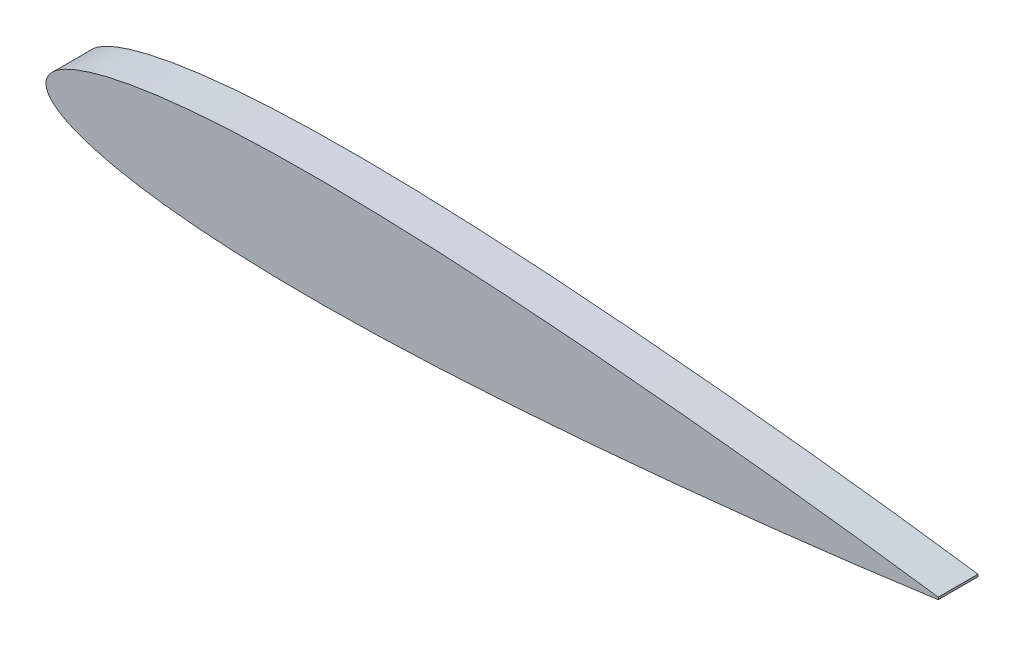
ISO-10303-21;
HEADER;
FILE_DESCRIPTION(('STEP AP214'),'2;1');
FILE_NAME('part.step','',(''),(''),'','','');
FILE_SCHEMA(('AUTOMOTIVE_DESIGN { 1 0 10303 214 1 1 1 1 }'));
ENDSEC;
DATA;
#1=APPLICATION_CONTEXT('core data for automotive mechanical design processes');
#2=APPLICATION_PROTOCOL_DEFINITION('international standard','automotive_design',2000,#1);
#3=PRODUCT_CONTEXT('',#1,'mechanical');
#4=PRODUCT('Part','Part','',(#3));
#5=PRODUCT_RELATED_PRODUCT_CATEGORY('part','',(#4));
#6=PRODUCT_DEFINITION_FORMATION('','',#4);
#7=PRODUCT_DEFINITION_CONTEXT('part definition',#1,'design');
#8=PRODUCT_DEFINITION('design','',#6,#7);
#9=PRODUCT_DEFINITION_SHAPE('','',#8);
#10=(LENGTH_UNIT() NAMED_UNIT(*) SI_UNIT(.MILLI.,.METRE.));
#11=(NAMED_UNIT(*) PLANE_ANGLE_UNIT() SI_UNIT($,.RADIAN.));
#12=(NAMED_UNIT(*) SI_UNIT($,.STERADIAN.) SOLID_ANGLE_UNIT());
#13=UNCERTAINTY_MEASURE_WITH_UNIT(LENGTH_MEASURE(1.E-05),#10,'distance_accuracy_value','');
#14=(GEOMETRIC_REPRESENTATION_CONTEXT(3) GLOBAL_UNCERTAINTY_ASSIGNED_CONTEXT((#13)) GLOBAL_UNIT_ASSIGNED_CONTEXT((#10,
#11,#12)) REPRESENTATION_CONTEXT('',''));
#15=CARTESIAN_POINT('',(0.,0.,0.));
#16=DIRECTION('',(0.,0.,1.));
#17=DIRECTION('',(1.,0.,0.));
#18=AXIS2_PLACEMENT_3D('',#15,#16,#17);
#19=CARTESIAN_POINT('',(0.,0.,-15.96));
#20=DIRECTION('',(0.,0.,-1.));
#21=DIRECTION('',(-1.,0.,0.));
#22=AXIS2_PLACEMENT_3D('',#19,#20,#21);
#23=PLANE('',#22);
#24=DIRECTION('',(0.,1.,0.));
#25=VECTOR('',#24,1.);
#26=CARTESIAN_POINT('',(358.4,0.451584,-15.96));
#27=LINE('',#26,#25);
#28=CARTESIAN_POINT('',(358.4,-0.451584,-15.96));
#29=VERTEX_POINT('',#28);
#30=CARTESIAN_POINT('',(358.4,0.451584,-15.96));
#31=VERTEX_POINT('',#30);
#32=EDGE_CURVE('E76',#29,#31,#27,.T.);
#33=ORIENTED_EDGE('',*,*,#32,.F.);
#34=CARTESIAN_POINT('',(358.4,0.451584,-15.96));
#35=CARTESIAN_POINT('',(358.370493196928,0.455776233714828,-15.96));
#36=CARTESIAN_POINT('',(358.25261621967,0.472523823654016,-15.96));
#37=CARTESIAN_POINT('',(357.987425172555,0.509004554861595,-15.96));
#38=CARTESIAN_POINT('',(357.545977130908,0.571487288729136,-15.96));
#39=CARTESIAN_POINT('',(356.928434569553,0.657604003981323,-15.96));
#40=CARTESIAN_POINT('',(356.135495470945,0.76782946819907,-15.96));
#41=CARTESIAN_POINT('',(355.16802369572,0.902869621931203,-15.96));
#42=CARTESIAN_POINT('',(354.026824630237,1.06054040723252,-15.96));
#43=CARTESIAN_POINT('',(352.713104426718,1.24205000537855,-15.96));
#44=CARTESIAN_POINT('',(351.228154302085,1.44589499909686,-15.96));
#45=CARTESIAN_POINT('',(349.573264694739,1.67141650364083,-15.96));
#46=CARTESIAN_POINT('',(347.750383540121,1.91916410557618,-15.96));
#47=CARTESIAN_POINT('',(345.761157155666,2.18746974730759,-15.96));
#48=CARTESIAN_POINT('',(343.607669146928,2.47588518340075,-15.96));
#49=CARTESIAN_POINT('',(341.291796969455,2.78355711519487,-15.96));
#50=CARTESIAN_POINT('',(338.816040016263,3.11048505249964,-15.96));
#51=CARTESIAN_POINT('',(336.182602929099,3.45454784442713,-15.96));
#52=CARTESIAN_POINT('',(333.394453609513,3.81635241442663,-15.96));
#53=CARTESIAN_POINT('',(330.453952290947,4.19323200753109,-15.96));
#54=CARTESIAN_POINT('',(327.364289766674,4.58663478596724,-15.96));
#55=CARTESIAN_POINT('',(324.128369502721,4.99331714979975,-15.96));
#56=CARTESIAN_POINT('',(320.74954470531,5.41415236384314,-15.96));
#57=CARTESIAN_POINT('',(317.230992263313,5.8470814427076,-15.96));
#58=CARTESIAN_POINT('',(313.576124387238,6.29243256153855,-15.96));
#59=CARTESIAN_POINT('',(309.788477158328,6.74700500674676,-15.96));
#60=CARTESIAN_POINT('',(305.872185102695,7.21230198787101,-15.96));
#61=CARTESIAN_POINT('',(301.830855108561,7.68581146667529,-15.96));
#62=CARTESIAN_POINT('',(297.668568710552,8.16751481913673,-15.96));
#63=CARTESIAN_POINT('',(293.389228219957,8.65519225894263,-15.96));
#64=CARTESIAN_POINT('',(288.997358247295,9.14961879621382,-15.96));
#65=CARTESIAN_POINT('',(284.497005463403,9.64770200602293,-15.96));
#66=CARTESIAN_POINT('',(279.892664590586,10.1500966217005,-15.96));
#67=CARTESIAN_POINT('',(275.189055561386,10.6553351937565,-15.96));
#68=CARTESIAN_POINT('',(270.390669948942,11.161881000402,-15.96));
#69=CARTESIAN_POINT('',(265.502352621321,11.6692852949686,-15.96));
#70=CARTESIAN_POINT('',(260.528816627339,12.1760728702755,-15.96));
#71=CARTESIAN_POINT('',(255.47508464716,12.6822919544396,-15.96));
#72=CARTESIAN_POINT('',(250.346003580755,13.1851651238216,-15.96));
#73=CARTESIAN_POINT('',(245.14670443553,13.684622224456,-15.96));
#74=CARTESIAN_POINT('',(239.882325695538,14.1796479403814,-15.96));
#75=CARTESIAN_POINT('',(234.558126291176,14.6679967797538,-15.96));
#76=CARTESIAN_POINT('',(229.179344053971,15.1507894231455,-15.96));
#77=CARTESIAN_POINT('',(223.75120657461,15.6240762341554,-15.96));
#78=CARTESIAN_POINT('',(218.279088861398,16.0891329946466,-15.96));
#79=CARTESIAN_POINT('',(212.768328251001,16.543067782085,-15.96));
#80=CARTESIAN_POINT('',(207.2244774486,16.9852149293373,-15.96));
#81=CARTESIAN_POINT('',(201.652931476875,17.414648206375,-15.96));
#82=CARTESIAN_POINT('',(196.059259461707,17.8295916473975,-15.96));
#83=CARTESIAN_POINT('',(190.448858154184,18.2290898422733,-15.96));
#84=CARTESIAN_POINT('',(184.827516110136,18.6125620183086,-15.96));
#85=CARTESIAN_POINT('',(179.200590053974,18.9767186889259,-15.96));
#86=CARTESIAN_POINT('',(173.573731270039,19.3225174604828,-15.96));
#87=CARTESIAN_POINT('',(167.952326337868,19.6471977310696,-15.96));
#88=CARTESIAN_POINT('',(162.341912302392,19.950068950909,-15.96));
#89=CARTESIAN_POINT('',(156.748241925018,20.2302804922831,-15.96));
#90=CARTESIAN_POINT('',(151.176632238083,20.4854026899935,-15.96));
#91=CARTESIAN_POINT('',(145.632758245639,20.7154488670723,-15.96));
#92=CARTESIAN_POINT('',(140.121946567659,20.9182569829813,-15.96));
#93=CARTESIAN_POINT('',(134.649743925097,21.0940322856751,-15.96));
#94=CARTESIAN_POINT('',(129.221583428834,21.2398126057764,-15.96));
#95=CARTESIAN_POINT('',(123.842657343405,21.3564120659633,-15.96));
#96=CARTESIAN_POINT('',(118.51842338381,21.4415290765211,-15.96));
#97=CARTESIAN_POINT('',(113.253915953801,21.4948407776102,-15.96));
#98=CARTESIAN_POINT('',(108.054506058199,21.515720335048,-15.96));
#99=CARTESIAN_POINT('',(102.92532967817,21.5026931618434,-15.96));
#100=CARTESIAN_POINT('',(97.871402962543,21.45584498211,-15.96));
#101=CARTESIAN_POINT('',(92.8977453422462,21.3741453240681,-15.96));
#102=CARTESIAN_POINT('',(88.0092520579012,21.257398428649,-15.96));
#103=CARTESIAN_POINT('',(83.2106980163782,21.1052260883741,-15.96));
#104=CARTESIAN_POINT('',(78.5068713089753,20.9171590667274,-15.96));
#105=CARTESIAN_POINT('',(73.9022855471289,20.6934730493298,-15.96));
#106=CARTESIAN_POINT('',(69.401758755573,20.4333901641286,-15.96));
#107=CARTESIAN_POINT('',(65.0095461770572,20.1376949233051,-15.96));
#108=CARTESIAN_POINT('',(60.7299809932176,19.8060772672351,-15.96));
#109=CARTESIAN_POINT('',(56.5673308009772,19.4391720988868,-15.96));
#110=CARTESIAN_POINT('',(52.5257065378964,19.0369276688947,-15.96));
#111=CARTESIAN_POINT('',(48.6089368903205,18.6007247798677,-15.96));
#112=CARTESIAN_POINT('',(44.8209842951147,18.1298557841559,-15.96));
#113=CARTESIAN_POINT('',(41.1655687814413,17.6258166649567,-15.96));
#114=CARTESIAN_POINT('',(37.6465027100503,17.0893540711679,-15.96));
#115=CARTESIAN_POINT('',(34.2670935527531,16.5207902787817,-15.96));
#116=CARTESIAN_POINT('',(31.0305196878124,15.9218406422211,-15.96));
#117=CARTESIAN_POINT('',(27.940065653207,15.2925685272096,-15.96));
#118=CARTESIAN_POINT('',(24.9987213419117,14.6349966648961,-15.96));
#119=CARTESIAN_POINT('',(22.2094980825763,13.9494048277724,-15.96));
#120=CARTESIAN_POINT('',(19.5749088940589,13.2371346038537,-15.96));
#121=CARTESIAN_POINT('',(17.0977042380235,12.4992287612201,-15.96));
#122=CARTESIAN_POINT('',(14.7801365667649,11.7370176406839,-15.96));
#123=CARTESIAN_POINT('',(12.6246655083971,10.9512973229477,-15.96));
#124=CARTESIAN_POINT('',(10.6328841259916,10.1435986148522,-15.96));
#125=CARTESIAN_POINT('',(8.80700026061472,9.31435554384509,-15.96));
#126=CARTESIAN_POINT('',(7.14845230077784,8.46512773432839,-15.96));
#127=CARTESIAN_POINT('',(5.65852450135493,7.59710185758636,-15.96));
#128=CARTESIAN_POINT('',(4.33936330088522,6.70944299208098,-15.96));
#129=CARTESIAN_POINT('',(3.19072986413884,5.80470755627818,-15.96));
#130=CARTESIAN_POINT('',(2.21466709335798,4.88155169010924,-15.96));
#131=CARTESIAN_POINT('',(1.41180252573559,3.94063714479814,-15.96));
#132=CARTESIAN_POINT('',(0.78321872523629,2.98150909089604,-15.96));
#133=CARTESIAN_POINT('',(0.331955096667186,2.00330583277747,-15.96));
#134=CARTESIAN_POINT('',(0.0601224574038582,1.00724560292494,-15.96));
#135=CARTESIAN_POINT('',(-0.0297935059370082,0.,-15.96));
#136=CARTESIAN_POINT('',(0.0601224574038674,-1.00724560292501,-15.96));
#137=CARTESIAN_POINT('',(0.331955096667174,-2.00330583277743,-15.96));
#138=CARTESIAN_POINT('',(0.783218725236317,-2.98150909089609,-15.96));
#139=CARTESIAN_POINT('',(1.41180252573558,-3.94063714479811,-15.96));
#140=CARTESIAN_POINT('',(2.21466709335798,-4.88155169010924,-15.96));
#141=CARTESIAN_POINT('',(3.19072986413887,-5.8047075562782,-15.96));
#142=CARTESIAN_POINT('',(4.33936330088518,-6.70944299208094,-15.96));
#143=CARTESIAN_POINT('',(5.65852450135498,-7.59710185758639,-15.96));
#144=CARTESIAN_POINT('',(7.14845230077778,-8.46512773432836,-15.96));
#145=CARTESIAN_POINT('',(8.80700026061478,-9.31435554384512,-15.96));
#146=CARTESIAN_POINT('',(10.6328841259916,-10.1435986148522,-15.96));
#147=CARTESIAN_POINT('',(12.6246655083971,-10.9512973229477,-15.96));
#148=CARTESIAN_POINT('',(14.7801365667649,-11.7370176406839,-15.96));
#149=CARTESIAN_POINT('',(17.0977042380235,-12.4992287612201,-15.96));
#150=CARTESIAN_POINT('',(19.5749088940588,-13.2371346038537,-15.96));
#151=CARTESIAN_POINT('',(22.2094980825764,-13.9494048277724,-15.96));
#152=CARTESIAN_POINT('',(24.9987213419116,-14.6349966648961,-15.96));
#153=CARTESIAN_POINT('',(27.940065653207,-15.2925685272096,-15.96));
#154=CARTESIAN_POINT('',(31.0305196878124,-15.9218406422211,-15.96));
#155=CARTESIAN_POINT('',(34.2670935527531,-16.5207902787817,-15.96));
#156=CARTESIAN_POINT('',(37.6465027100503,-17.0893540711679,-15.96));
#157=CARTESIAN_POINT('',(41.1655687814413,-17.6258166649567,-15.96));
#158=CARTESIAN_POINT('',(44.8209842951148,-18.1298557841559,-15.96));
#159=CARTESIAN_POINT('',(48.6089368903205,-18.6007247798677,-15.96));
#160=CARTESIAN_POINT('',(52.5257065378963,-19.0369276688947,-15.96));
#161=CARTESIAN_POINT('',(56.5673308009772,-19.4391720988868,-15.96));
#162=CARTESIAN_POINT('',(60.7299809932176,-19.8060772672351,-15.96));
#163=CARTESIAN_POINT('',(65.0095461770572,-20.1376949233051,-15.96));
#164=CARTESIAN_POINT('',(69.4017587555731,-20.4333901641286,-15.96));
#165=CARTESIAN_POINT('',(73.9022855471288,-20.6934730493298,-15.96));
#166=CARTESIAN_POINT('',(78.5068713089753,-20.9171590667274,-15.96));
#167=CARTESIAN_POINT('',(83.2106980163783,-21.1052260883741,-15.96));
#168=CARTESIAN_POINT('',(88.0092520579012,-21.257398428649,-15.96));
#169=CARTESIAN_POINT('',(92.8977453422463,-21.3741453240681,-15.96));
#170=CARTESIAN_POINT('',(97.871402962543,-21.45584498211,-15.96));
#171=CARTESIAN_POINT('',(102.92532967817,-21.5026931618434,-15.96));
#172=CARTESIAN_POINT('',(108.054506058199,-21.515720335048,-15.96));
#173=CARTESIAN_POINT('',(113.253915953801,-21.4948407776102,-15.96));
#174=CARTESIAN_POINT('',(118.51842338381,-21.4415290765211,-15.96));
#175=CARTESIAN_POINT('',(123.842657343405,-21.3564120659633,-15.96));
#176=CARTESIAN_POINT('',(129.221583428834,-21.2398126057764,-15.96));
#177=CARTESIAN_POINT('',(134.649743925097,-21.0940322856751,-15.96));
#178=CARTESIAN_POINT('',(140.121946567659,-20.9182569829813,-15.96));
#179=CARTESIAN_POINT('',(145.632758245639,-20.7154488670723,-15.96));
#180=CARTESIAN_POINT('',(151.176632238083,-20.4854026899935,-15.96));
#181=CARTESIAN_POINT('',(156.748241925018,-20.2302804922831,-15.96));
#182=CARTESIAN_POINT('',(162.341912302392,-19.950068950909,-15.96));
#183=CARTESIAN_POINT('',(167.952326337868,-19.6471977310696,-15.96));
#184=CARTESIAN_POINT('',(173.573731270039,-19.3225174604828,-15.96));
#185=CARTESIAN_POINT('',(179.200590053974,-18.9767186889259,-15.96));
#186=CARTESIAN_POINT('',(184.827516110136,-18.6125620183086,-15.96));
#187=CARTESIAN_POINT('',(190.448858154184,-18.2290898422733,-15.96));
#188=CARTESIAN_POINT('',(196.059259461707,-17.8295916473975,-15.96));
#189=CARTESIAN_POINT('',(201.652931476875,-17.414648206375,-15.96));
#190=CARTESIAN_POINT('',(207.2244774486,-16.9852149293373,-15.96));
#191=CARTESIAN_POINT('',(212.768328251002,-16.543067782085,-15.96));
#192=CARTESIAN_POINT('',(218.279088861398,-16.0891329946467,-15.96));
#193=CARTESIAN_POINT('',(223.75120657461,-15.6240762341554,-15.96));
#194=CARTESIAN_POINT('',(229.179344053971,-15.1507894231455,-15.96));
#195=CARTESIAN_POINT('',(234.558126291176,-14.6679967797538,-15.96));
#196=CARTESIAN_POINT('',(239.882325695538,-14.1796479403815,-15.96));
#197=CARTESIAN_POINT('',(245.14670443553,-13.684622224456,-15.96));
#198=CARTESIAN_POINT('',(250.346003580755,-13.1851651238216,-15.96));
#199=CARTESIAN_POINT('',(255.47508464716,-12.6822919544396,-15.96));
#200=CARTESIAN_POINT('',(260.528816627339,-12.1760728702755,-15.96));
#201=CARTESIAN_POINT('',(265.502352621321,-11.6692852949686,-15.96));
#202=CARTESIAN_POINT('',(270.390669948942,-11.161881000402,-15.96));
#203=CARTESIAN_POINT('',(275.189055561386,-10.6553351937565,-15.96));
#204=CARTESIAN_POINT('',(279.892664590586,-10.1500966217005,-15.96));
#205=CARTESIAN_POINT('',(284.497005463403,-9.64770200602293,-15.96));
#206=CARTESIAN_POINT('',(288.997358247295,-9.14961879621382,-15.96));
#207=CARTESIAN_POINT('',(293.389228219957,-8.65519225894263,-15.96));
#208=CARTESIAN_POINT('',(297.668568710552,-8.16751481913673,-15.96));
#209=CARTESIAN_POINT('',(301.830855108561,-7.68581146667529,-15.96));
#210=CARTESIAN_POINT('',(305.872185102695,-7.212301987871,-15.96));
#211=CARTESIAN_POINT('',(309.788477158328,-6.74700500674677,-15.96));
#212=CARTESIAN_POINT('',(313.576124387238,-6.29243256153854,-15.96));
#213=CARTESIAN_POINT('',(317.230992263313,-5.8470814427076,-15.96));
#214=CARTESIAN_POINT('',(320.74954470531,-5.41415236384314,-15.96));
#215=CARTESIAN_POINT('',(324.128369502721,-4.99331714979975,-15.96));
#216=CARTESIAN_POINT('',(327.364289766674,-4.58663478596724,-15.96));
#217=CARTESIAN_POINT('',(330.453952290948,-4.19323200753109,-15.96));
#218=CARTESIAN_POINT('',(333.394453609513,-3.81635241442663,-15.96));
#219=CARTESIAN_POINT('',(336.182602929099,-3.45454784442714,-15.96));
#220=CARTESIAN_POINT('',(338.816040016263,-3.11048505249964,-15.96));
#221=CARTESIAN_POINT('',(341.291796969455,-2.78355711519488,-15.96));
#222=CARTESIAN_POINT('',(343.607669146929,-2.47588518340074,-15.96));
#223=CARTESIAN_POINT('',(345.761157155665,-2.18746974730759,-15.96));
#224=CARTESIAN_POINT('',(347.750383540121,-1.91916410557619,-15.96));
#225=CARTESIAN_POINT('',(349.573264694739,-1.67141650364083,-15.96));
#226=CARTESIAN_POINT('',(351.228154302085,-1.44589499909687,-15.96));
#227=CARTESIAN_POINT('',(352.713104426718,-1.24205000537854,-15.96));
#228=CARTESIAN_POINT('',(354.026824630237,-1.06054040723252,-15.96));
#229=CARTESIAN_POINT('',(355.16802369572,-0.902869621931208,-15.96));
#230=CARTESIAN_POINT('',(356.135495470944,-0.767829468199068,-15.96));
#231=CARTESIAN_POINT('',(356.928434569554,-0.657604003981325,-15.96));
#232=CARTESIAN_POINT('',(357.545977130908,-0.571487288729137,-15.96));
#233=CARTESIAN_POINT('',(357.987425172555,-0.509004554861588,-15.96));
#234=CARTESIAN_POINT('',(358.25261621967,-0.47252382365402,-15.96));
#235=CARTESIAN_POINT('',(358.370493196928,-0.455776233714828,-15.96));
#236=CARTESIAN_POINT('',(358.4,-0.451584,-15.96));
#237=B_SPLINE_CURVE_WITH_KNOTS('',3,(#34,#35,#36,#37,#38,#39,#40,#41,#42,#43,#44,#45,#46,#47,
#48,#49,#50,#51,#52,#53,#54,#55,#56,#57,#58,#59,#60,#61,#62,#63,#64,#65,#66,#67,#68,#69,#70,#71,
#72,#73,#74,#75,#76,#77,#78,#79,#80,#81,#82,#83,#84,#85,#86,#87,#88,#89,#90,#91,#92,#93,#94,#95,
#96,#97,#98,#99,#100,#101,#102,#103,#104,#105,#106,#107,#108,#109,#110,#111,#112,#113,#114,#115,
#116,#117,#118,#119,#120,#121,#122,#123,#124,#125,#126,#127,#128,#129,#130,#131,#132,#133,#134,
#135,#136,#137,#138,#139,#140,#141,#142,#143,#144,#145,#146,#147,#148,#149,#150,#151,#152,#153,
#154,#155,#156,#157,#158,#159,#160,#161,#162,#163,#164,#165,#166,#167,#168,#169,#170,#171,#172,
#173,#174,#175,#176,#177,#178,#179,#180,#181,#182,#183,#184,#185,#186,#187,#188,#189,#190,#191,
#192,#193,#194,#195,#196,#197,#198,#199,#200,#201,#202,#203,#204,#205,#206,#207,#208,#209,#210,
#211,#212,#213,#214,#215,#216,#217,#218,#219,#220,#221,#222,#223,#224,#225,#226,#227,#228,#229,
#230,#231,#232,#233,#234,#235,#236),.UNSPECIFIED.,.F.,.F.,(4,1,1,1,1,1,1,1,1,1,1,1,1,1,1,1,1,1,
1,1,1,1,1,1,1,1,1,1,1,1,1,1,1,1,1,1,1,1,1,1,1,1,1,1,1,1,1,1,1,1,1,1,1,1,1,1,1,1,1,1,1,1,1,1,1,1,
1,1,1,1,1,1,1,1,1,1,1,1,1,1,1,1,1,1,1,1,1,1,1,1,1,1,1,1,1,1,1,1,1,1,1,1,1,1,1,1,1,1,1,1,1,1,1,1,
1,1,1,1,1,1,1,1,1,1,1,1,1,1,1,1,1,1,1,1,1,1,1,1,1,1,1,1,1,1,1,1,1,1,1,1,1,1,1,1,1,1,1,1,1,1,1,1,
1,1,1,1,1,1,1,1,1,1,1,1,1,1,1,1,1,1,1,1,1,1,1,1,1,1,1,1,1,1,1,1,1,1,1,1,1,1,4),(0.,
0.000122334685529821,0.000488715870335703,0.00109879445914942,0.00195243329731984,
0.00304810915211973,0.00438491822225046,0.00596217320825858,0.00777695765033849,
0.00982865458191716,0.0121147026135149,0.0146326721515981,0.0173799386422229,0.0203539418697686,
0.0235511532622392,0.0269695677934044,0.0306045553366446,0.0344526540631313,0.0385102119110623,
0.0427733466182698,0.0472373755184655,0.0518973795594255,0.0567497788161726,0.0617891102127594,
0.0670107040499395,0.0724087330304301,0.0779776170975953,0.0837128746848141,0.0896079582255273,
0.095656982363499,0.101854329102739,0.108193623471066,0.114668875684429,0.121272580730217,
0.127999291759845,0.13484205214712,0.141793465992359,0.148847458804994,0.155996644176533,
0.163233587045413,0.17055179122624,0.177942942148787,0.185400953355924,0.192917519538065,
0.200485637527841,0.208097902807133,0.215745944323043,0.223423313064161,0.231121652123,
0.238833587932003,0.246551172778975,0.254267121712422,0.261974036753156,0.269664105998503,
0.277330017641686,0.28496345175744,0.292558134520306,0.300105810669371,0.3075992571915,
0.315031719153494,0.322395052969653,0.329683551894733,0.336889104335749,0.344005587508555,
0.351025923481184,0.357943068769403,0.364751482358984,0.371444179013118,0.378014700899271,
0.384458095702654,0.390767470508659,0.39693747175061,0.402962242571828,0.408836982180112,
0.414556417806281,0.420114835398579,0.425508487872464,0.430732820118306,0.435782703644853,
0.440654597399385,0.445344093807314,0.449848747340873,0.454164877223233,0.458289244219897,
0.462219480592938,0.465953817225262,0.469490763796453,0.472828095082235,0.475966668605404,
0.478906194974527,0.481648398541721,0.484195581410727,0.486551513527973,0.488722246247119,
0.490716990623679,0.492546624351328,0.49422803642228,0.495782873163403,0.497239121391327,
0.498631854771565,0.5,0.501368145228435,0.502760878608673,0.504217126836597,0.50577196357772,
0.507453375648672,0.509283009376321,0.511277753752881,0.513448486472028,0.515804418589273,
0.518351601458279,0.521093805025473,0.524033331394596,0.527171904917765,0.530509236203548,
0.534046182774738,0.537780519407062,0.541710755780103,0.545835122776767,0.550151252659127,
0.554655906192686,0.559345402600616,0.564217296355147,0.569267179881694,0.574491512127536,
0.579885164601421,0.585443582193719,0.591163017819888,0.597037757428172,0.60306252824939,
0.609232529491341,0.615541904297346,0.621985299100729,0.628555820986882,0.635248517641016,
0.642056931230597,0.648974076518817,0.655994412491445,0.663110895664251,0.670316448105267,
0.677604947030347,0.684968280846506,0.6924007428085,0.699894189330629,0.707441865479694,
0.71503654824256,0.722669982358314,0.730335894001497,0.738025963246844,0.745732878287579,
0.753448827221025,0.761166412067997,0.768878347877,0.776576686935839,0.784254055676957,
0.791902097192868,0.799514362472159,0.807082480461936,0.814599046644077,0.822057057851214,
0.82944820877376,0.836766412954587,0.844003355823467,0.851152541195006,0.858206534007641,
0.86515794785288,0.872000708240155,0.878727419269783,0.885331124315571,0.891806376528934,
0.898145670897261,0.904343017636501,0.910392041774473,0.916287125315186,0.922022382902405,
0.92759126696957,0.932989295950061,0.938210889787241,0.943250221183828,0.948102620440575,
0.952762624481535,0.95722665338173,0.961489788088938,0.965547345936869,0.969395444663356,
0.973030432206596,0.976448846737761,0.979646058130232,0.982620061357777,0.985367327848402,
0.987885297386485,0.990171345418083,0.992223042349662,0.994037826791742,0.99561508177775,
0.99695189084788,0.99804756670268,0.998901205540851,0.999511284129664,0.99987766531447,1.),.UNSPECIFIED.);
#238=EDGE_CURVE('E81',#31,#29,#237,.T.);
#239=ORIENTED_EDGE('',*,*,#238,.F.);
#240=EDGE_LOOP('',(#33,#239));
#241=FACE_BOUND('',#240,.T.);
#242=ADVANCED_FACE('F44',(#241),#23,.T.);
#243=CARTESIAN_POINT('',(358.4,0.451584,-15.96));
#244=DIRECTION('',(1.,0.,0.));
#245=DIRECTION('',(0.,0.,-1.));
#246=AXIS2_PLACEMENT_3D('',#243,#244,#245);
#247=PLANE('',#246);
#248=DIRECTION('',(0.,1.,0.));
#249=VECTOR('',#248,1.);
#250=CARTESIAN_POINT('',(358.4,0.451584,0.));
#251=LINE('',#250,#249);
#252=CARTESIAN_POINT('',(358.4,-0.451584,0.));
#253=VERTEX_POINT('',#252);
#254=CARTESIAN_POINT('',(358.4,0.451584,0.));
#255=VERTEX_POINT('',#254);
#256=EDGE_CURVE('E78',#253,#255,#251,.T.);
#257=ORIENTED_EDGE('',*,*,#256,.F.);
#258=DIRECTION('',(0.,0.,1.));
#259=VECTOR('',#258,1.);
#260=CARTESIAN_POINT('',(358.4,-0.451584,-15.96));
#261=LINE('',#260,#259);
#262=EDGE_CURVE('E49',#29,#253,#261,.T.);
#263=ORIENTED_EDGE('',*,*,#262,.F.);
#264=ORIENTED_EDGE('',*,*,#32,.T.);
#265=DIRECTION('',(0.,0.,1.));
#266=VECTOR('',#265,1.);
#267=CARTESIAN_POINT('',(358.4,0.451584,-15.96));
#268=LINE('',#267,#266);
#269=EDGE_CURVE('E11',#31,#255,#268,.T.);
#270=ORIENTED_EDGE('',*,*,#269,.T.);
#271=EDGE_LOOP('',(#257,#263,#264,#270));
#272=FACE_BOUND('',#271,.T.);
#273=ADVANCED_FACE('F74',(#272),#247,.T.);
#274=DIRECTION('',(0.,0.,1.));
#275=VECTOR('',#274,1.);
#276=SURFACE_OF_LINEAR_EXTRUSION('',#237,#275);
#277=CARTESIAN_POINT('',(358.4,0.451584,0.));
#278=CARTESIAN_POINT('',(358.370493196928,0.455776233714828,0.));
#279=CARTESIAN_POINT('',(358.25261621967,0.472523823654016,0.));
#280=CARTESIAN_POINT('',(357.987425172555,0.509004554861595,0.));
#281=CARTESIAN_POINT('',(357.545977130908,0.571487288729136,0.));
#282=CARTESIAN_POINT('',(356.928434569553,0.657604003981323,0.));
#283=CARTESIAN_POINT('',(356.135495470945,0.76782946819907,0.));
#284=CARTESIAN_POINT('',(355.16802369572,0.902869621931203,0.));
#285=CARTESIAN_POINT('',(354.026824630237,1.06054040723252,0.));
#286=CARTESIAN_POINT('',(352.713104426718,1.24205000537855,0.));
#287=CARTESIAN_POINT('',(351.228154302085,1.44589499909686,0.));
#288=CARTESIAN_POINT('',(349.573264694739,1.67141650364083,0.));
#289=CARTESIAN_POINT('',(347.750383540121,1.91916410557618,0.));
#290=CARTESIAN_POINT('',(345.761157155666,2.18746974730759,0.));
#291=CARTESIAN_POINT('',(343.607669146928,2.47588518340075,0.));
#292=CARTESIAN_POINT('',(341.291796969455,2.78355711519487,0.));
#293=CARTESIAN_POINT('',(338.816040016263,3.11048505249964,0.));
#294=CARTESIAN_POINT('',(336.182602929099,3.45454784442713,0.));
#295=CARTESIAN_POINT('',(333.394453609513,3.81635241442663,0.));
#296=CARTESIAN_POINT('',(330.453952290947,4.19323200753109,0.));
#297=CARTESIAN_POINT('',(327.364289766674,4.58663478596724,0.));
#298=CARTESIAN_POINT('',(324.128369502721,4.99331714979975,0.));
#299=CARTESIAN_POINT('',(320.74954470531,5.41415236384314,0.));
#300=CARTESIAN_POINT('',(317.230992263313,5.8470814427076,0.));
#301=CARTESIAN_POINT('',(313.576124387238,6.29243256153855,0.));
#302=CARTESIAN_POINT('',(309.788477158328,6.74700500674676,0.));
#303=CARTESIAN_POINT('',(305.872185102695,7.21230198787101,0.));
#304=CARTESIAN_POINT('',(301.830855108561,7.68581146667529,0.));
#305=CARTESIAN_POINT('',(297.668568710552,8.16751481913673,0.));
#306=CARTESIAN_POINT('',(293.389228219957,8.65519225894263,0.));
#307=CARTESIAN_POINT('',(288.997358247295,9.14961879621382,0.));
#308=CARTESIAN_POINT('',(284.497005463403,9.64770200602293,0.));
#309=CARTESIAN_POINT('',(279.892664590586,10.1500966217005,0.));
#310=CARTESIAN_POINT('',(275.189055561386,10.6553351937565,0.));
#311=CARTESIAN_POINT('',(270.390669948942,11.161881000402,0.));
#312=CARTESIAN_POINT('',(265.502352621321,11.6692852949686,0.));
#313=CARTESIAN_POINT('',(260.528816627339,12.1760728702755,0.));
#314=CARTESIAN_POINT('',(255.47508464716,12.6822919544396,0.));
#315=CARTESIAN_POINT('',(250.346003580755,13.1851651238216,0.));
#316=CARTESIAN_POINT('',(245.14670443553,13.684622224456,0.));
#317=CARTESIAN_POINT('',(239.882325695538,14.1796479403814,0.));
#318=CARTESIAN_POINT('',(234.558126291176,14.6679967797538,0.));
#319=CARTESIAN_POINT('',(229.179344053971,15.1507894231455,0.));
#320=CARTESIAN_POINT('',(223.75120657461,15.6240762341554,0.));
#321=CARTESIAN_POINT('',(218.279088861398,16.0891329946466,0.));
#322=CARTESIAN_POINT('',(212.768328251001,16.543067782085,0.));
#323=CARTESIAN_POINT('',(207.2244774486,16.9852149293373,0.));
#324=CARTESIAN_POINT('',(201.652931476875,17.414648206375,0.));
#325=CARTESIAN_POINT('',(196.059259461707,17.8295916473975,0.));
#326=CARTESIAN_POINT('',(190.448858154184,18.2290898422733,0.));
#327=CARTESIAN_POINT('',(184.827516110136,18.6125620183086,0.));
#328=CARTESIAN_POINT('',(179.200590053974,18.9767186889259,0.));
#329=CARTESIAN_POINT('',(173.573731270039,19.3225174604828,0.));
#330=CARTESIAN_POINT('',(167.952326337868,19.6471977310696,0.));
#331=CARTESIAN_POINT('',(162.341912302392,19.950068950909,0.));
#332=CARTESIAN_POINT('',(156.748241925018,20.2302804922831,0.));
#333=CARTESIAN_POINT('',(151.176632238083,20.4854026899935,0.));
#334=CARTESIAN_POINT('',(145.632758245639,20.7154488670723,0.));
#335=CARTESIAN_POINT('',(140.121946567659,20.9182569829813,0.));
#336=CARTESIAN_POINT('',(134.649743925097,21.0940322856751,0.));
#337=CARTESIAN_POINT('',(129.221583428834,21.2398126057764,0.));
#338=CARTESIAN_POINT('',(123.842657343405,21.3564120659633,0.));
#339=CARTESIAN_POINT('',(118.51842338381,21.4415290765211,0.));
#340=CARTESIAN_POINT('',(113.253915953801,21.4948407776102,0.));
#341=CARTESIAN_POINT('',(108.054506058199,21.515720335048,0.));
#342=CARTESIAN_POINT('',(102.92532967817,21.5026931618434,0.));
#343=CARTESIAN_POINT('',(97.871402962543,21.45584498211,0.));
#344=CARTESIAN_POINT('',(92.8977453422462,21.3741453240681,0.));
#345=CARTESIAN_POINT('',(88.0092520579012,21.257398428649,0.));
#346=CARTESIAN_POINT('',(83.2106980163782,21.1052260883741,0.));
#347=CARTESIAN_POINT('',(78.5068713089753,20.9171590667274,0.));
#348=CARTESIAN_POINT('',(73.9022855471289,20.6934730493298,0.));
#349=CARTESIAN_POINT('',(69.401758755573,20.4333901641286,0.));
#350=CARTESIAN_POINT('',(65.0095461770572,20.1376949233051,0.));
#351=CARTESIAN_POINT('',(60.7299809932176,19.8060772672351,0.));
#352=CARTESIAN_POINT('',(56.5673308009772,19.4391720988868,0.));
#353=CARTESIAN_POINT('',(52.5257065378964,19.0369276688947,0.));
#354=CARTESIAN_POINT('',(48.6089368903205,18.6007247798677,0.));
#355=CARTESIAN_POINT('',(44.8209842951147,18.1298557841559,0.));
#356=CARTESIAN_POINT('',(41.1655687814413,17.6258166649567,0.));
#357=CARTESIAN_POINT('',(37.6465027100503,17.0893540711679,0.));
#358=CARTESIAN_POINT('',(34.2670935527531,16.5207902787817,0.));
#359=CARTESIAN_POINT('',(31.0305196878124,15.9218406422211,0.));
#360=CARTESIAN_POINT('',(27.940065653207,15.2925685272096,0.));
#361=CARTESIAN_POINT('',(24.9987213419117,14.6349966648961,0.));
#362=CARTESIAN_POINT('',(22.2094980825763,13.9494048277724,0.));
#363=CARTESIAN_POINT('',(19.5749088940589,13.2371346038537,0.));
#364=CARTESIAN_POINT('',(17.0977042380235,12.4992287612201,0.));
#365=CARTESIAN_POINT('',(14.7801365667649,11.7370176406839,0.));
#366=CARTESIAN_POINT('',(12.6246655083971,10.9512973229477,0.));
#367=CARTESIAN_POINT('',(10.6328841259916,10.1435986148522,0.));
#368=CARTESIAN_POINT('',(8.80700026061472,9.31435554384509,0.));
#369=CARTESIAN_POINT('',(7.14845230077784,8.46512773432839,0.));
#370=CARTESIAN_POINT('',(5.65852450135493,7.59710185758636,0.));
#371=CARTESIAN_POINT('',(4.33936330088522,6.70944299208098,0.));
#372=CARTESIAN_POINT('',(3.19072986413884,5.80470755627818,0.));
#373=CARTESIAN_POINT('',(2.21466709335798,4.88155169010924,0.));
#374=CARTESIAN_POINT('',(1.41180252573559,3.94063714479814,0.));
#375=CARTESIAN_POINT('',(0.78321872523629,2.98150909089604,0.));
#376=CARTESIAN_POINT('',(0.331955096667186,2.00330583277747,0.));
#377=CARTESIAN_POINT('',(0.0601224574038582,1.00724560292494,0.));
#378=CARTESIAN_POINT('',(-0.0297935059370082,0.,0.));
#379=CARTESIAN_POINT('',(0.0601224574038674,-1.00724560292501,0.));
#380=CARTESIAN_POINT('',(0.331955096667174,-2.00330583277743,0.));
#381=CARTESIAN_POINT('',(0.783218725236317,-2.98150909089609,0.));
#382=CARTESIAN_POINT('',(1.41180252573558,-3.94063714479811,0.));
#383=CARTESIAN_POINT('',(2.21466709335798,-4.88155169010924,0.));
#384=CARTESIAN_POINT('',(3.19072986413887,-5.8047075562782,0.));
#385=CARTESIAN_POINT('',(4.33936330088518,-6.70944299208094,0.));
#386=CARTESIAN_POINT('',(5.65852450135498,-7.59710185758639,0.));
#387=CARTESIAN_POINT('',(7.14845230077778,-8.46512773432836,0.));
#388=CARTESIAN_POINT('',(8.80700026061478,-9.31435554384512,0.));
#389=CARTESIAN_POINT('',(10.6328841259916,-10.1435986148522,0.));
#390=CARTESIAN_POINT('',(12.6246655083971,-10.9512973229477,0.));
#391=CARTESIAN_POINT('',(14.7801365667649,-11.7370176406839,0.));
#392=CARTESIAN_POINT('',(17.0977042380235,-12.4992287612201,0.));
#393=CARTESIAN_POINT('',(19.5749088940588,-13.2371346038537,0.));
#394=CARTESIAN_POINT('',(22.2094980825764,-13.9494048277724,0.));
#395=CARTESIAN_POINT('',(24.9987213419116,-14.6349966648961,0.));
#396=CARTESIAN_POINT('',(27.940065653207,-15.2925685272096,0.));
#397=CARTESIAN_POINT('',(31.0305196878124,-15.9218406422211,0.));
#398=CARTESIAN_POINT('',(34.2670935527531,-16.5207902787817,0.));
#399=CARTESIAN_POINT('',(37.6465027100503,-17.0893540711679,0.));
#400=CARTESIAN_POINT('',(41.1655687814413,-17.6258166649567,0.));
#401=CARTESIAN_POINT('',(44.8209842951148,-18.1298557841559,0.));
#402=CARTESIAN_POINT('',(48.6089368903205,-18.6007247798677,0.));
#403=CARTESIAN_POINT('',(52.5257065378963,-19.0369276688947,0.));
#404=CARTESIAN_POINT('',(56.5673308009772,-19.4391720988868,0.));
#405=CARTESIAN_POINT('',(60.7299809932176,-19.8060772672351,0.));
#406=CARTESIAN_POINT('',(65.0095461770572,-20.1376949233051,0.));
#407=CARTESIAN_POINT('',(69.4017587555731,-20.4333901641286,0.));
#408=CARTESIAN_POINT('',(73.9022855471288,-20.6934730493298,0.));
#409=CARTESIAN_POINT('',(78.5068713089753,-20.9171590667274,0.));
#410=CARTESIAN_POINT('',(83.2106980163783,-21.1052260883741,0.));
#411=CARTESIAN_POINT('',(88.0092520579012,-21.257398428649,0.));
#412=CARTESIAN_POINT('',(92.8977453422463,-21.3741453240681,0.));
#413=CARTESIAN_POINT('',(97.871402962543,-21.45584498211,0.));
#414=CARTESIAN_POINT('',(102.92532967817,-21.5026931618434,0.));
#415=CARTESIAN_POINT('',(108.054506058199,-21.515720335048,0.));
#416=CARTESIAN_POINT('',(113.253915953801,-21.4948407776102,0.));
#417=CARTESIAN_POINT('',(118.51842338381,-21.4415290765211,0.));
#418=CARTESIAN_POINT('',(123.842657343405,-21.3564120659633,0.));
#419=CARTESIAN_POINT('',(129.221583428834,-21.2398126057764,0.));
#420=CARTESIAN_POINT('',(134.649743925097,-21.0940322856751,0.));
#421=CARTESIAN_POINT('',(140.121946567659,-20.9182569829813,0.));
#422=CARTESIAN_POINT('',(145.632758245639,-20.7154488670723,0.));
#423=CARTESIAN_POINT('',(151.176632238083,-20.4854026899935,0.));
#424=CARTESIAN_POINT('',(156.748241925018,-20.2302804922831,0.));
#425=CARTESIAN_POINT('',(162.341912302392,-19.950068950909,0.));
#426=CARTESIAN_POINT('',(167.952326337868,-19.6471977310696,0.));
#427=CARTESIAN_POINT('',(173.573731270039,-19.3225174604828,0.));
#428=CARTESIAN_POINT('',(179.200590053974,-18.9767186889259,0.));
#429=CARTESIAN_POINT('',(184.827516110136,-18.6125620183086,0.));
#430=CARTESIAN_POINT('',(190.448858154184,-18.2290898422733,0.));
#431=CARTESIAN_POINT('',(196.059259461707,-17.8295916473975,0.));
#432=CARTESIAN_POINT('',(201.652931476875,-17.414648206375,0.));
#433=CARTESIAN_POINT('',(207.2244774486,-16.9852149293373,0.));
#434=CARTESIAN_POINT('',(212.768328251002,-16.543067782085,0.));
#435=CARTESIAN_POINT('',(218.279088861398,-16.0891329946467,0.));
#436=CARTESIAN_POINT('',(223.75120657461,-15.6240762341554,0.));
#437=CARTESIAN_POINT('',(229.179344053971,-15.1507894231455,0.));
#438=CARTESIAN_POINT('',(234.558126291176,-14.6679967797538,0.));
#439=CARTESIAN_POINT('',(239.882325695538,-14.1796479403815,0.));
#440=CARTESIAN_POINT('',(245.14670443553,-13.684622224456,0.));
#441=CARTESIAN_POINT('',(250.346003580755,-13.1851651238216,0.));
#442=CARTESIAN_POINT('',(255.47508464716,-12.6822919544396,0.));
#443=CARTESIAN_POINT('',(260.528816627339,-12.1760728702755,0.));
#444=CARTESIAN_POINT('',(265.502352621321,-11.6692852949686,0.));
#445=CARTESIAN_POINT('',(270.390669948942,-11.161881000402,0.));
#446=CARTESIAN_POINT('',(275.189055561386,-10.6553351937565,0.));
#447=CARTESIAN_POINT('',(279.892664590586,-10.1500966217005,0.));
#448=CARTESIAN_POINT('',(284.497005463403,-9.64770200602293,0.));
#449=CARTESIAN_POINT('',(288.997358247295,-9.14961879621382,0.));
#450=CARTESIAN_POINT('',(293.389228219957,-8.65519225894263,0.));
#451=CARTESIAN_POINT('',(297.668568710552,-8.16751481913673,0.));
#452=CARTESIAN_POINT('',(301.830855108561,-7.68581146667529,0.));
#453=CARTESIAN_POINT('',(305.872185102695,-7.212301987871,0.));
#454=CARTESIAN_POINT('',(309.788477158328,-6.74700500674677,0.));
#455=CARTESIAN_POINT('',(313.576124387238,-6.29243256153854,0.));
#456=CARTESIAN_POINT('',(317.230992263313,-5.8470814427076,0.));
#457=CARTESIAN_POINT('',(320.74954470531,-5.41415236384314,0.));
#458=CARTESIAN_POINT('',(324.128369502721,-4.99331714979975,0.));
#459=CARTESIAN_POINT('',(327.364289766674,-4.58663478596724,0.));
#460=CARTESIAN_POINT('',(330.453952290948,-4.19323200753109,0.));
#461=CARTESIAN_POINT('',(333.394453609513,-3.81635241442663,0.));
#462=CARTESIAN_POINT('',(336.182602929099,-3.45454784442714,0.));
#463=CARTESIAN_POINT('',(338.816040016263,-3.11048505249964,0.));
#464=CARTESIAN_POINT('',(341.291796969455,-2.78355711519488,0.));
#465=CARTESIAN_POINT('',(343.607669146929,-2.47588518340074,0.));
#466=CARTESIAN_POINT('',(345.761157155665,-2.18746974730759,0.));
#467=CARTESIAN_POINT('',(347.750383540121,-1.91916410557619,0.));
#468=CARTESIAN_POINT('',(349.573264694739,-1.67141650364083,0.));
#469=CARTESIAN_POINT('',(351.228154302085,-1.44589499909687,0.));
#470=CARTESIAN_POINT('',(352.713104426718,-1.24205000537854,0.));
#471=CARTESIAN_POINT('',(354.026824630237,-1.06054040723252,0.));
#472=CARTESIAN_POINT('',(355.16802369572,-0.902869621931208,0.));
#473=CARTESIAN_POINT('',(356.135495470944,-0.767829468199068,0.));
#474=CARTESIAN_POINT('',(356.928434569554,-0.657604003981325,0.));
#475=CARTESIAN_POINT('',(357.545977130908,-0.571487288729137,0.));
#476=CARTESIAN_POINT('',(357.987425172555,-0.509004554861588,0.));
#477=CARTESIAN_POINT('',(358.25261621967,-0.47252382365402,0.));
#478=CARTESIAN_POINT('',(358.370493196928,-0.455776233714828,0.));
#479=CARTESIAN_POINT('',(358.4,-0.451584,0.));
#480=B_SPLINE_CURVE_WITH_KNOTS('',3,(#277,#278,#279,#280,#281,#282,#283,#284,#285,#286,#287,
#288,#289,#290,#291,#292,#293,#294,#295,#296,#297,#298,#299,#300,#301,#302,#303,#304,#305,#306,
#307,#308,#309,#310,#311,#312,#313,#314,#315,#316,#317,#318,#319,#320,#321,#322,#323,#324,#325,
#326,#327,#328,#329,#330,#331,#332,#333,#334,#335,#336,#337,#338,#339,#340,#341,#342,#343,#344,
#345,#346,#347,#348,#349,#350,#351,#352,#353,#354,#355,#356,#357,#358,#359,#360,#361,#362,#363,
#364,#365,#366,#367,#368,#369,#370,#371,#372,#373,#374,#375,#376,#377,#378,#379,#380,#381,#382,
#383,#384,#385,#386,#387,#388,#389,#390,#391,#392,#393,#394,#395,#396,#397,#398,#399,#400,#401,
#402,#403,#404,#405,#406,#407,#408,#409,#410,#411,#412,#413,#414,#415,#416,#417,#418,#419,#420,
#421,#422,#423,#424,#425,#426,#427,#428,#429,#430,#431,#432,#433,#434,#435,#436,#437,#438,#439,
#440,#441,#442,#443,#444,#445,#446,#447,#448,#449,#450,#451,#452,#453,#454,#455,#456,#457,#458,
#459,#460,#461,#462,#463,#464,#465,#466,#467,#468,#469,#470,#471,#472,#473,#474,#475,#476,#477,
#478,#479),.UNSPECIFIED.,.F.,.F.,(4,1,1,1,1,1,1,1,1,1,1,1,1,1,1,1,1,1,1,1,1,1,1,1,1,1,1,1,1,1,1,
1,1,1,1,1,1,1,1,1,1,1,1,1,1,1,1,1,1,1,1,1,1,1,1,1,1,1,1,1,1,1,1,1,1,1,1,1,1,1,1,1,1,1,1,1,1,1,1,
1,1,1,1,1,1,1,1,1,1,1,1,1,1,1,1,1,1,1,1,1,1,1,1,1,1,1,1,1,1,1,1,1,1,1,1,1,1,1,1,1,1,1,1,1,1,1,1,
1,1,1,1,1,1,1,1,1,1,1,1,1,1,1,1,1,1,1,1,1,1,1,1,1,1,1,1,1,1,1,1,1,1,1,1,1,1,1,1,1,1,1,1,1,1,1,1,
1,1,1,1,1,1,1,1,1,1,1,1,1,1,1,1,1,1,1,1,1,1,1,1,1,4),(0.,0.000122334685529821,
0.000488715870335703,0.00109879445914942,0.00195243329731984,0.00304810915211973,
0.00438491822225046,0.00596217320825858,0.00777695765033849,0.00982865458191716,
0.0121147026135149,0.0146326721515981,0.0173799386422229,0.0203539418697686,0.0235511532622392,
0.0269695677934044,0.0306045553366446,0.0344526540631313,0.0385102119110623,0.0427733466182698,
0.0472373755184655,0.0518973795594255,0.0567497788161726,0.0617891102127594,0.0670107040499395,
0.0724087330304301,0.0779776170975953,0.0837128746848141,0.0896079582255273,0.095656982363499,
0.101854329102739,0.108193623471066,0.114668875684429,0.121272580730217,0.127999291759845,
0.13484205214712,0.141793465992359,0.148847458804994,0.155996644176533,0.163233587045413,
0.17055179122624,0.177942942148787,0.185400953355924,0.192917519538065,0.200485637527841,
0.208097902807133,0.215745944323043,0.223423313064161,0.231121652123,0.238833587932003,
0.246551172778975,0.254267121712422,0.261974036753156,0.269664105998503,0.277330017641686,
0.28496345175744,0.292558134520306,0.300105810669371,0.3075992571915,0.315031719153494,
0.322395052969653,0.329683551894733,0.336889104335749,0.344005587508555,0.351025923481184,
0.357943068769403,0.364751482358984,0.371444179013118,0.378014700899271,0.384458095702654,
0.390767470508659,0.39693747175061,0.402962242571828,0.408836982180112,0.414556417806281,
0.420114835398579,0.425508487872464,0.430732820118306,0.435782703644853,0.440654597399385,
0.445344093807314,0.449848747340873,0.454164877223233,0.458289244219897,0.462219480592938,
0.465953817225262,0.469490763796453,0.472828095082235,0.475966668605404,0.478906194974527,
0.481648398541721,0.484195581410727,0.486551513527973,0.488722246247119,0.490716990623679,
0.492546624351328,0.49422803642228,0.495782873163403,0.497239121391327,0.498631854771565,0.5,
0.501368145228435,0.502760878608673,0.504217126836597,0.50577196357772,0.507453375648672,
0.509283009376321,0.511277753752881,0.513448486472028,0.515804418589273,0.518351601458279,
0.521093805025473,0.524033331394596,0.527171904917765,0.530509236203548,0.534046182774738,
0.537780519407062,0.541710755780103,0.545835122776767,0.550151252659127,0.554655906192686,
0.559345402600616,0.564217296355147,0.569267179881694,0.574491512127536,0.579885164601421,
0.585443582193719,0.591163017819888,0.597037757428172,0.60306252824939,0.609232529491341,
0.615541904297346,0.621985299100729,0.628555820986882,0.635248517641016,0.642056931230597,
0.648974076518817,0.655994412491445,0.663110895664251,0.670316448105267,0.677604947030347,
0.684968280846506,0.6924007428085,0.699894189330629,0.707441865479694,0.71503654824256,
0.722669982358314,0.730335894001497,0.738025963246844,0.745732878287579,0.753448827221025,
0.761166412067997,0.768878347877,0.776576686935839,0.784254055676957,0.791902097192868,
0.799514362472159,0.807082480461936,0.814599046644077,0.822057057851214,0.82944820877376,
0.836766412954587,0.844003355823467,0.851152541195006,0.858206534007641,0.86515794785288,
0.872000708240155,0.878727419269783,0.885331124315571,0.891806376528934,0.898145670897261,
0.904343017636501,0.910392041774473,0.916287125315186,0.922022382902405,0.92759126696957,
0.932989295950061,0.938210889787241,0.943250221183828,0.948102620440575,0.952762624481535,
0.95722665338173,0.961489788088938,0.965547345936869,0.969395444663356,0.973030432206596,
0.976448846737761,0.979646058130232,0.982620061357777,0.985367327848402,0.987885297386485,
0.990171345418083,0.992223042349662,0.994037826791742,0.99561508177775,0.99695189084788,
0.99804756670268,0.998901205540851,0.999511284129664,0.99987766531447,1.),.UNSPECIFIED.);
#481=EDGE_CURVE('E69',#255,#253,#480,.T.);
#482=ORIENTED_EDGE('',*,*,#481,.F.);
#483=ORIENTED_EDGE('',*,*,#269,.F.);
#484=ORIENTED_EDGE('',*,*,#238,.T.);
#485=ORIENTED_EDGE('',*,*,#262,.T.);
#486=EDGE_LOOP('',(#482,#483,#484,#485));
#487=FACE_BOUND('',#486,.T.);
#488=ADVANCED_FACE('F50',(#487),#276,.T.);
#489=CARTESIAN_POINT('',(0.,0.,0.));
#490=DIRECTION('',(0.,0.,-1.));
#491=DIRECTION('',(-1.,0.,0.));
#492=AXIS2_PLACEMENT_3D('',#489,#490,#491);
#493=PLANE('',#492);
#494=ORIENTED_EDGE('',*,*,#481,.T.);
#495=ORIENTED_EDGE('',*,*,#256,.T.);
#496=EDGE_LOOP('',(#494,#495));
#497=FACE_BOUND('',#496,.T.);
#498=ADVANCED_FACE('F83',(#497),#493,.F.);
#499=CLOSED_SHELL('',(#242,#273,#488,#498));
#500=MANIFOLD_SOLID_BREP('B2',#499);
#501=ADVANCED_BREP_SHAPE_REPRESENTATION('',(#18,#500),#14);
#502=SHAPE_DEFINITION_REPRESENTATION(#9,#501);
ENDSEC;
END-ISO-10303-21;
